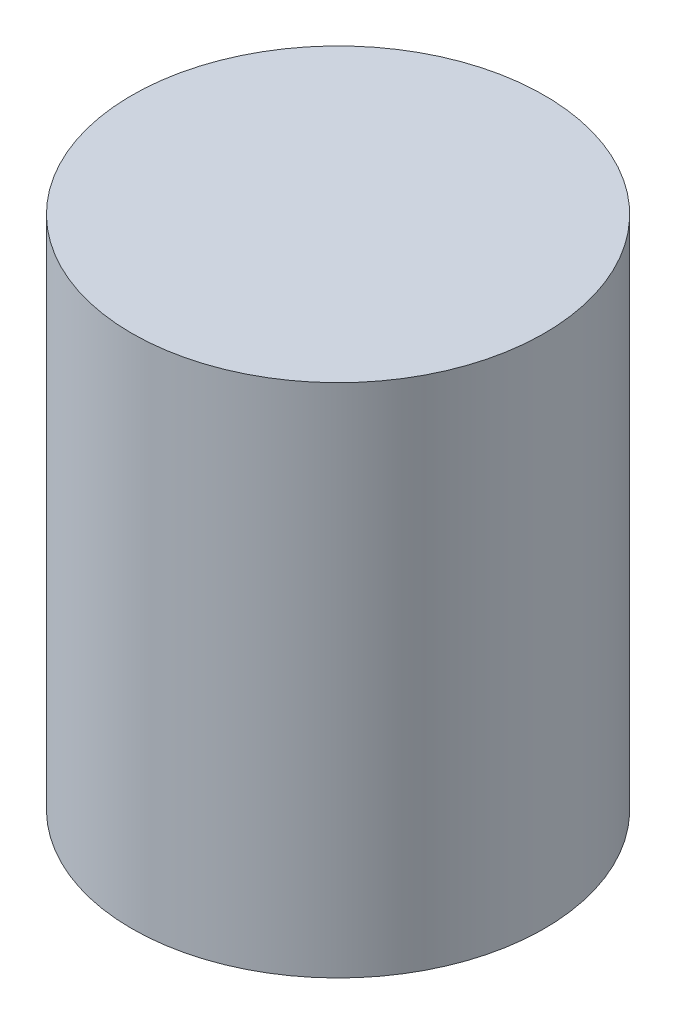
ISO-10303-21;
HEADER;
FILE_DESCRIPTION(('STEP AP214'),'2;1');
FILE_NAME('part.step','',(''),(''),'','','');
FILE_SCHEMA(('AUTOMOTIVE_DESIGN { 1 0 10303 214 1 1 1 1 }'));
ENDSEC;
DATA;
#1=APPLICATION_CONTEXT('core data for automotive mechanical design processes');
#2=APPLICATION_PROTOCOL_DEFINITION('international standard','automotive_design',2000,#1);
#3=PRODUCT_CONTEXT('',#1,'mechanical');
#4=PRODUCT('Part','Part','',(#3));
#5=PRODUCT_RELATED_PRODUCT_CATEGORY('part','',(#4));
#6=PRODUCT_DEFINITION_FORMATION('','',#4);
#7=PRODUCT_DEFINITION_CONTEXT('part definition',#1,'design');
#8=PRODUCT_DEFINITION('design','',#6,#7);
#9=PRODUCT_DEFINITION_SHAPE('','',#8);
#10=(LENGTH_UNIT() NAMED_UNIT(*) SI_UNIT(.MILLI.,.METRE.));
#11=(NAMED_UNIT(*) PLANE_ANGLE_UNIT() SI_UNIT($,.RADIAN.));
#12=(NAMED_UNIT(*) SI_UNIT($,.STERADIAN.) SOLID_ANGLE_UNIT());
#13=UNCERTAINTY_MEASURE_WITH_UNIT(LENGTH_MEASURE(1.E-05),#10,'distance_accuracy_value','');
#14=(GEOMETRIC_REPRESENTATION_CONTEXT(3) GLOBAL_UNCERTAINTY_ASSIGNED_CONTEXT((#13)) GLOBAL_UNIT_ASSIGNED_CONTEXT((#10,
#11,#12)) REPRESENTATION_CONTEXT('',''));
#15=CARTESIAN_POINT('',(0.,0.,0.));
#16=DIRECTION('',(0.,0.,1.));
#17=DIRECTION('',(1.,0.,0.));
#18=AXIS2_PLACEMENT_3D('',#15,#16,#17);
#19=CARTESIAN_POINT('',(0.,6.,0.));
#20=DIRECTION('',(0.,-1.,0.));
#21=DIRECTION('',(0.,0.,-1.));
#22=AXIS2_PLACEMENT_3D('',#19,#20,#21);
#23=CYLINDRICAL_SURFACE('',#22,2.4);
#24=CARTESIAN_POINT('',(0.,6.,0.));
#25=DIRECTION('',(0.,1.,0.));
#26=DIRECTION('',(0.,0.,1.));
#27=AXIS2_PLACEMENT_3D('',#24,#25,#26);
#28=CIRCLE('',#27,2.4);
#29=CARTESIAN_POINT('',(0.,6.,2.4));
#30=VERTEX_POINT('',#29);
#31=EDGE_CURVE('E10',#30,#30,#28,.T.);
#32=ORIENTED_EDGE('',*,*,#31,.F.);
#33=EDGE_LOOP('',(#32));
#34=FACE_BOUND('',#33,.T.);
#35=CARTESIAN_POINT('',(0.,0.,0.));
#36=DIRECTION('',(0.,1.,0.));
#37=DIRECTION('',(0.,0.,1.));
#38=AXIS2_PLACEMENT_3D('',#35,#36,#37);
#39=CIRCLE('',#38,2.4);
#40=CARTESIAN_POINT('',(0.,0.,2.4));
#41=VERTEX_POINT('',#40);
#42=EDGE_CURVE('E40',#41,#41,#39,.T.);
#43=ORIENTED_EDGE('',*,*,#42,.T.);
#44=EDGE_LOOP('',(#43));
#45=FACE_BOUND('',#44,.T.);
#46=ADVANCED_FACE('F37',(#34,#45),#23,.T.);
#47=CARTESIAN_POINT('',(0.,6.,0.));
#48=DIRECTION('',(0.,1.,0.));
#49=DIRECTION('',(0.,0.,1.));
#50=AXIS2_PLACEMENT_3D('',#47,#48,#49);
#51=PLANE('',#50);
#52=ORIENTED_EDGE('',*,*,#31,.T.);
#53=EDGE_LOOP('',(#52));
#54=FACE_BOUND('',#53,.T.);
#55=ADVANCED_FACE('F52',(#54),#51,.T.);
#56=CARTESIAN_POINT('',(0.,0.,0.));
#57=DIRECTION('',(0.,1.,0.));
#58=DIRECTION('',(0.,0.,1.));
#59=AXIS2_PLACEMENT_3D('',#56,#57,#58);
#60=PLANE('',#59);
#61=ORIENTED_EDGE('',*,*,#42,.F.);
#62=EDGE_LOOP('',(#61));
#63=FACE_BOUND('',#62,.T.);
#64=ADVANCED_FACE('F50',(#63),#60,.F.);
#65=CLOSED_SHELL('',(#46,#55,#64));
#66=MANIFOLD_SOLID_BREP('B2',#65);
#67=ADVANCED_BREP_SHAPE_REPRESENTATION('',(#18,#66),#14);
#68=SHAPE_DEFINITION_REPRESENTATION(#9,#67);
ENDSEC;
END-ISO-10303-21;
